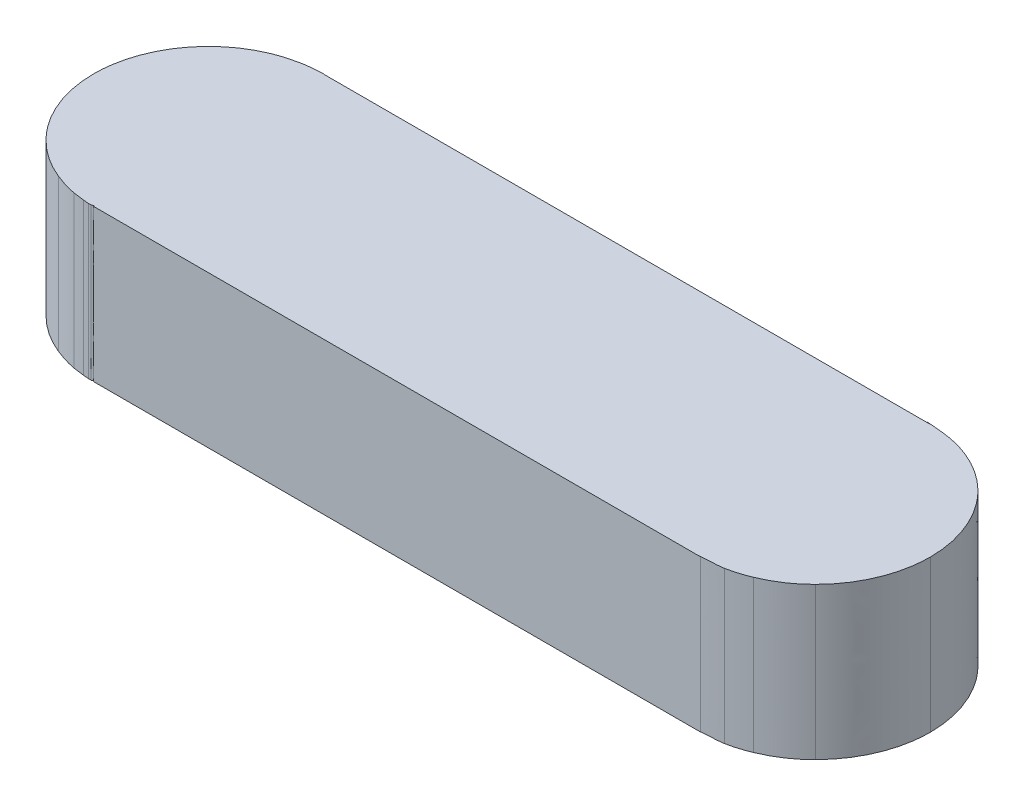
ISO-10303-21;
HEADER;
FILE_DESCRIPTION(('STEP AP214'),'2;1');
FILE_NAME('part.step','',(''),(''),'','','');
FILE_SCHEMA(('AUTOMOTIVE_DESIGN { 1 0 10303 214 1 1 1 1 }'));
ENDSEC;
DATA;
#1=APPLICATION_CONTEXT('core data for automotive mechanical design processes');
#2=APPLICATION_PROTOCOL_DEFINITION('international standard','automotive_design',2000,#1);
#3=PRODUCT_CONTEXT('',#1,'mechanical');
#4=PRODUCT('Part','Part','',(#3));
#5=PRODUCT_RELATED_PRODUCT_CATEGORY('part','',(#4));
#6=PRODUCT_DEFINITION_FORMATION('','',#4);
#7=PRODUCT_DEFINITION_CONTEXT('part definition',#1,'design');
#8=PRODUCT_DEFINITION('design','',#6,#7);
#9=PRODUCT_DEFINITION_SHAPE('','',#8);
#10=(LENGTH_UNIT() NAMED_UNIT(*) SI_UNIT(.MILLI.,.METRE.));
#11=(NAMED_UNIT(*) PLANE_ANGLE_UNIT() SI_UNIT($,.RADIAN.));
#12=(NAMED_UNIT(*) SI_UNIT($,.STERADIAN.) SOLID_ANGLE_UNIT());
#13=UNCERTAINTY_MEASURE_WITH_UNIT(LENGTH_MEASURE(1.E-05),#10,'distance_accuracy_value','');
#14=(GEOMETRIC_REPRESENTATION_CONTEXT(3) GLOBAL_UNCERTAINTY_ASSIGNED_CONTEXT((#13)) GLOBAL_UNIT_ASSIGNED_CONTEXT((#10,
#11,#12)) REPRESENTATION_CONTEXT('',''));
#15=CARTESIAN_POINT('',(0.,0.,0.));
#16=DIRECTION('',(0.,0.,1.));
#17=DIRECTION('',(1.,0.,0.));
#18=AXIS2_PLACEMENT_3D('',#15,#16,#17);
#19=CARTESIAN_POINT('',(5.0230024,6.35,-9.8240342));
#20=CARTESIAN_POINT('',(5.091938,6.35,-9.8440494));
#21=CARTESIAN_POINT('',(4.9471326,6.35,-9.8240342));
#22=CARTESIAN_POINT('',(4.912741,6.35,-9.8240342));
#23=B_SPLINE_CURVE_WITH_KNOTS('',3,(#19,#20,#21,#22),.UNSPECIFIED.,.F.,.F.,(4,4),(0.,1.),.UNSPECIFIED.);
#24=DIRECTION('',(0.,-1.,0.));
#25=VECTOR('',#24,1.);
#26=SURFACE_OF_LINEAR_EXTRUSION('',#23,#25);
#27=CARTESIAN_POINT('',(5.0230024,0.,-9.8240342));
#28=CARTESIAN_POINT('',(5.091938,0.,-9.8440494));
#29=CARTESIAN_POINT('',(4.9471326,0.,-9.8240342));
#30=CARTESIAN_POINT('',(4.912741,0.,-9.8240342));
#31=B_SPLINE_CURVE_WITH_KNOTS('',3,(#27,#28,#29,#30),.UNSPECIFIED.,.F.,.F.,(4,4),(0.,1.),.UNSPECIFIED.);
#32=CARTESIAN_POINT('',(5.0230024,0.,-9.8240342));
#33=VERTEX_POINT('',#32);
#34=CARTESIAN_POINT('',(4.912741,0.,-9.8240342));
#35=VERTEX_POINT('',#34);
#36=EDGE_CURVE('E466',#33,#35,#31,.T.);
#37=ORIENTED_EDGE('',*,*,#36,.T.);
#38=DIRECTION('',(0.,-1.,0.));
#39=VECTOR('',#38,1.);
#40=CARTESIAN_POINT('',(4.912741,6.35,-9.8240342));
#41=LINE('',#40,#39);
#42=CARTESIAN_POINT('',(4.912741,6.35,-9.8240342));
#43=VERTEX_POINT('',#42);
#44=EDGE_CURVE('E11',#43,#35,#41,.T.);
#45=ORIENTED_EDGE('',*,*,#44,.F.);
#46=CARTESIAN_POINT('',(5.0230024,6.35,-9.8240342));
#47=VERTEX_POINT('',#46);
#48=EDGE_CURVE('E442',#47,#43,#23,.T.);
#49=ORIENTED_EDGE('',*,*,#48,.F.);
#50=DIRECTION('',(0.,-1.,0.));
#51=VECTOR('',#50,1.);
#52=CARTESIAN_POINT('',(5.0230024,6.35,-9.8240342));
#53=LINE('',#52,#51);
#54=EDGE_CURVE('E223',#47,#33,#53,.T.);
#55=ORIENTED_EDGE('',*,*,#54,.T.);
#56=EDGE_LOOP('',(#37,#45,#49,#55));
#57=FACE_BOUND('',#56,.T.);
#58=ADVANCED_FACE('F34',(#57),#26,.F.);
#59=CARTESIAN_POINT('',(4.912741,6.35,-9.8240342));
#60=CARTESIAN_POINT('',(4.8782478,6.35,-9.8240342));
#61=CARTESIAN_POINT('',(4.8368966,6.35,-9.8190304));
#62=CARTESIAN_POINT('',(4.802505,6.35,-9.8190304));
#63=B_SPLINE_CURVE_WITH_KNOTS('',3,(#59,#60,#61,#62),.UNSPECIFIED.,.F.,.F.,(4,4),(0.,1.),.UNSPECIFIED.);
#64=DIRECTION('',(0.,-1.,0.));
#65=VECTOR('',#64,1.);
#66=SURFACE_OF_LINEAR_EXTRUSION('',#63,#65);
#67=CARTESIAN_POINT('',(4.912741,0.,-9.8240342));
#68=CARTESIAN_POINT('',(4.8782478,0.,-9.8240342));
#69=CARTESIAN_POINT('',(4.8368966,0.,-9.8190304));
#70=CARTESIAN_POINT('',(4.802505,0.,-9.8190304));
#71=B_SPLINE_CURVE_WITH_KNOTS('',3,(#67,#68,#69,#70),.UNSPECIFIED.,.F.,.F.,(4,4),(0.,1.),.UNSPECIFIED.);
#72=CARTESIAN_POINT('',(4.802505,0.,-9.8190304));
#73=VERTEX_POINT('',#72);
#74=EDGE_CURVE('E457',#35,#73,#71,.T.);
#75=ORIENTED_EDGE('',*,*,#74,.T.);
#76=DIRECTION('',(0.,-1.,0.));
#77=VECTOR('',#76,1.);
#78=CARTESIAN_POINT('',(4.802505,6.35,-9.8190304));
#79=LINE('',#78,#77);
#80=CARTESIAN_POINT('',(4.802505,6.35,-9.8190304));
#81=VERTEX_POINT('',#80);
#82=EDGE_CURVE('E43',#81,#73,#79,.T.);
#83=ORIENTED_EDGE('',*,*,#82,.F.);
#84=EDGE_CURVE('E142',#43,#81,#63,.T.);
#85=ORIENTED_EDGE('',*,*,#84,.F.);
#86=ORIENTED_EDGE('',*,*,#44,.T.);
#87=EDGE_LOOP('',(#75,#83,#85,#86));
#88=FACE_BOUND('',#87,.T.);
#89=ADVANCED_FACE('F449',(#88),#66,.F.);
#90=CARTESIAN_POINT('',(4.802505,6.35,-9.8190304));
#91=CARTESIAN_POINT('',(4.7266352,6.35,-9.8190304));
#92=CARTESIAN_POINT('',(4.650994,6.35,-9.814052));
#93=CARTESIAN_POINT('',(4.5750988,6.35,-9.8040444));
#94=B_SPLINE_CURVE_WITH_KNOTS('',3,(#90,#91,#92,#93),.UNSPECIFIED.,.F.,.F.,(4,4),(0.,1.),.UNSPECIFIED.);
#95=DIRECTION('',(0.,-1.,0.));
#96=VECTOR('',#95,1.);
#97=SURFACE_OF_LINEAR_EXTRUSION('',#94,#96);
#98=CARTESIAN_POINT('',(4.802505,0.,-9.8190304));
#99=CARTESIAN_POINT('',(4.7266352,0.,-9.8190304));
#100=CARTESIAN_POINT('',(4.650994,0.,-9.814052));
#101=CARTESIAN_POINT('',(4.5750988,0.,-9.8040444));
#102=B_SPLINE_CURVE_WITH_KNOTS('',3,(#98,#99,#100,#101),.UNSPECIFIED.,.F.,.F.,(4,4),(0.,1.),.UNSPECIFIED.);
#103=CARTESIAN_POINT('',(4.5750988,0.,-9.8040444));
#104=VERTEX_POINT('',#103);
#105=EDGE_CURVE('E465',#73,#104,#102,.T.);
#106=ORIENTED_EDGE('',*,*,#105,.T.);
#107=DIRECTION('',(0.,-1.,0.));
#108=VECTOR('',#107,1.);
#109=CARTESIAN_POINT('',(4.5750988,6.35,-9.8040444));
#110=LINE('',#109,#108);
#111=CARTESIAN_POINT('',(4.5750988,6.35,-9.8040444));
#112=VERTEX_POINT('',#111);
#113=EDGE_CURVE('E470',#112,#104,#110,.T.);
#114=ORIENTED_EDGE('',*,*,#113,.F.);
#115=EDGE_CURVE('E428',#81,#112,#94,.T.);
#116=ORIENTED_EDGE('',*,*,#115,.F.);
#117=ORIENTED_EDGE('',*,*,#82,.T.);
#118=EDGE_LOOP('',(#106,#114,#116,#117));
#119=FACE_BOUND('',#118,.T.);
#120=ADVANCED_FACE('F421',(#119),#97,.F.);
#121=CARTESIAN_POINT('',(4.5750988,6.35,-9.8040444));
#122=CARTESIAN_POINT('',(4.4167044,6.35,-9.789033));
#123=CARTESIAN_POINT('',(4.265041,6.35,-9.7690432));
#124=CARTESIAN_POINT('',(4.1134538,6.35,-9.7350326));
#125=B_SPLINE_CURVE_WITH_KNOTS('',3,(#121,#122,#123,#124),.UNSPECIFIED.,.F.,.F.,(4,4),(0.,1.),.UNSPECIFIED.);
#126=DIRECTION('',(0.,-1.,0.));
#127=VECTOR('',#126,1.);
#128=SURFACE_OF_LINEAR_EXTRUSION('',#125,#127);
#129=CARTESIAN_POINT('',(4.5750988,0.,-9.8040444));
#130=CARTESIAN_POINT('',(4.4167044,0.,-9.789033));
#131=CARTESIAN_POINT('',(4.265041,0.,-9.7690432));
#132=CARTESIAN_POINT('',(4.1134538,0.,-9.7350326));
#133=B_SPLINE_CURVE_WITH_KNOTS('',3,(#129,#130,#131,#132),.UNSPECIFIED.,.F.,.F.,(4,4),(0.,1.),.UNSPECIFIED.);
#134=CARTESIAN_POINT('',(4.1134538,0.,-9.7350326));
#135=VERTEX_POINT('',#134);
#136=EDGE_CURVE('E474',#104,#135,#133,.T.);
#137=ORIENTED_EDGE('',*,*,#136,.T.);
#138=DIRECTION('',(0.,-1.,0.));
#139=VECTOR('',#138,1.);
#140=CARTESIAN_POINT('',(4.1134538,6.35,-9.7350326));
#141=LINE('',#140,#139);
#142=CARTESIAN_POINT('',(4.1134538,6.35,-9.7350326));
#143=VERTEX_POINT('',#142);
#144=EDGE_CURVE('E668',#143,#135,#141,.T.);
#145=ORIENTED_EDGE('',*,*,#144,.F.);
#146=EDGE_CURVE('E424',#112,#143,#125,.T.);
#147=ORIENTED_EDGE('',*,*,#146,.F.);
#148=ORIENTED_EDGE('',*,*,#113,.T.);
#149=EDGE_LOOP('',(#137,#145,#147,#148));
#150=FACE_BOUND('',#149,.T.);
#151=ADVANCED_FACE('F417',(#150),#128,.F.);
#152=CARTESIAN_POINT('',(4.1134538,6.35,-9.7350326));
#153=CARTESIAN_POINT('',(3.7964872,6.35,-9.6730312));
#154=CARTESIAN_POINT('',(3.4864548,6.35,-9.583547));
#155=CARTESIAN_POINT('',(3.1832804,6.35,-9.4595442));
#156=B_SPLINE_CURVE_WITH_KNOTS('',3,(#152,#153,#154,#155),.UNSPECIFIED.,.F.,.F.,(4,4),(0.,1.),.UNSPECIFIED.);
#157=DIRECTION('',(0.,-1.,0.));
#158=VECTOR('',#157,1.);
#159=SURFACE_OF_LINEAR_EXTRUSION('',#156,#158);
#160=CARTESIAN_POINT('',(4.1134538,0.,-9.7350326));
#161=CARTESIAN_POINT('',(3.7964872,0.,-9.6730312));
#162=CARTESIAN_POINT('',(3.4864548,0.,-9.583547));
#163=CARTESIAN_POINT('',(3.1832804,0.,-9.4595442));
#164=B_SPLINE_CURVE_WITH_KNOTS('',3,(#160,#161,#162,#163),.UNSPECIFIED.,.F.,.F.,(4,4),(0.,1.),.UNSPECIFIED.);
#165=CARTESIAN_POINT('',(3.1832804,0.,-9.4595442));
#166=VERTEX_POINT('',#165);
#167=EDGE_CURVE('E476',#135,#166,#164,.T.);
#168=ORIENTED_EDGE('',*,*,#167,.T.);
#169=DIRECTION('',(0.,-1.,0.));
#170=VECTOR('',#169,1.);
#171=CARTESIAN_POINT('',(3.1832804,6.35,-9.4595442));
#172=LINE('',#171,#170);
#173=CARTESIAN_POINT('',(3.1832804,6.35,-9.4595442));
#174=VERTEX_POINT('',#173);
#175=EDGE_CURVE('E665',#174,#166,#172,.T.);
#176=ORIENTED_EDGE('',*,*,#175,.F.);
#177=EDGE_CURVE('E402',#143,#174,#156,.T.);
#178=ORIENTED_EDGE('',*,*,#177,.F.);
#179=ORIENTED_EDGE('',*,*,#144,.T.);
#180=EDGE_LOOP('',(#168,#176,#178,#179));
#181=FACE_BOUND('',#180,.T.);
#182=ADVANCED_FACE('F413',(#181),#159,.F.);
#183=CARTESIAN_POINT('',(3.1832804,6.35,-9.4595442));
#184=CARTESIAN_POINT('',(2.5838404,6.35,-9.2115386));
#185=CARTESIAN_POINT('',(2.0877276,6.35,-8.8738964));
#186=CARTESIAN_POINT('',(1.6260826,6.35,-8.4191348));
#187=B_SPLINE_CURVE_WITH_KNOTS('',3,(#183,#184,#185,#186),.UNSPECIFIED.,.F.,.F.,(4,4),(0.,1.),.UNSPECIFIED.);
#188=DIRECTION('',(0.,-1.,0.));
#189=VECTOR('',#188,1.);
#190=SURFACE_OF_LINEAR_EXTRUSION('',#187,#189);
#191=CARTESIAN_POINT('',(3.1832804,0.,-9.4595442));
#192=CARTESIAN_POINT('',(2.5838404,0.,-9.2115386));
#193=CARTESIAN_POINT('',(2.0877276,0.,-8.8738964));
#194=CARTESIAN_POINT('',(1.6260826,0.,-8.4191348));
#195=B_SPLINE_CURVE_WITH_KNOTS('',3,(#191,#192,#193,#194),.UNSPECIFIED.,.F.,.F.,(4,4),(0.,1.),.UNSPECIFIED.);
#196=CARTESIAN_POINT('',(1.6260826,0.,-8.4191348));
#197=VERTEX_POINT('',#196);
#198=EDGE_CURVE('E494',#166,#197,#195,.T.);
#199=ORIENTED_EDGE('',*,*,#198,.T.);
#200=DIRECTION('',(0.,-1.,0.));
#201=VECTOR('',#200,1.);
#202=CARTESIAN_POINT('',(1.6260826,6.35,-8.4191348));
#203=LINE('',#202,#201);
#204=CARTESIAN_POINT('',(1.6260826,6.35,-8.4191348));
#205=VERTEX_POINT('',#204);
#206=EDGE_CURVE('E662',#205,#197,#203,.T.);
#207=ORIENTED_EDGE('',*,*,#206,.F.);
#208=EDGE_CURVE('E394',#174,#205,#187,.T.);
#209=ORIENTED_EDGE('',*,*,#208,.F.);
#210=ORIENTED_EDGE('',*,*,#175,.T.);
#211=EDGE_LOOP('',(#199,#207,#209,#210));
#212=FACE_BOUND('',#211,.T.);
#213=ADVANCED_FACE('F410',(#212),#190,.F.);
#214=CARTESIAN_POINT('',(1.6260826,6.35,-8.4191348));
#215=CARTESIAN_POINT('',(0.7234682,6.35,-7.5165458));
#216=CARTESIAN_POINT('',(0.2204974,6.35,-6.2969394));
#217=CARTESIAN_POINT('',(0.2204974,6.35,-5.0222404));
#218=B_SPLINE_CURVE_WITH_KNOTS('',3,(#214,#215,#216,#217),.UNSPECIFIED.,.F.,.F.,(4,4),(0.,1.),.UNSPECIFIED.);
#219=DIRECTION('',(0.,-1.,0.));
#220=VECTOR('',#219,1.);
#221=SURFACE_OF_LINEAR_EXTRUSION('',#218,#220);
#222=CARTESIAN_POINT('',(1.6260826,0.,-8.4191348));
#223=CARTESIAN_POINT('',(0.7234682,0.,-7.5165458));
#224=CARTESIAN_POINT('',(0.2204974,0.,-6.2969394));
#225=CARTESIAN_POINT('',(0.2204974,0.,-5.0222404));
#226=B_SPLINE_CURVE_WITH_KNOTS('',3,(#222,#223,#224,#225),.UNSPECIFIED.,.F.,.F.,(4,4),(0.,1.),.UNSPECIFIED.);
#227=CARTESIAN_POINT('',(0.2204974,0.,-5.0222404));
#228=VERTEX_POINT('',#227);
#229=EDGE_CURVE('E501',#197,#228,#226,.T.);
#230=ORIENTED_EDGE('',*,*,#229,.T.);
#231=DIRECTION('',(0.,-1.,0.));
#232=VECTOR('',#231,1.);
#233=CARTESIAN_POINT('',(0.2204974,6.35,-5.0222404));
#234=LINE('',#233,#232);
#235=CARTESIAN_POINT('',(0.2204974,6.35,-5.0222404));
#236=VERTEX_POINT('',#235);
#237=EDGE_CURVE('E659',#236,#228,#234,.T.);
#238=ORIENTED_EDGE('',*,*,#237,.F.);
#239=EDGE_CURVE('E386',#205,#236,#218,.T.);
#240=ORIENTED_EDGE('',*,*,#239,.F.);
#241=ORIENTED_EDGE('',*,*,#206,.T.);
#242=EDGE_LOOP('',(#230,#238,#240,#241));
#243=FACE_BOUND('',#242,.T.);
#244=ADVANCED_FACE('F378',(#243),#221,.F.);
#245=CARTESIAN_POINT('',(0.2204974,6.35,-5.0222404));
#246=CARTESIAN_POINT('',(0.2204974,6.35,-3.7475922));
#247=CARTESIAN_POINT('',(0.7234682,6.35,-2.5280366));
#248=CARTESIAN_POINT('',(1.6260826,6.35,-1.6253968));
#249=B_SPLINE_CURVE_WITH_KNOTS('',3,(#245,#246,#247,#248),.UNSPECIFIED.,.F.,.F.,(4,4),(0.,1.),.UNSPECIFIED.);
#250=DIRECTION('',(0.,-1.,0.));
#251=VECTOR('',#250,1.);
#252=SURFACE_OF_LINEAR_EXTRUSION('',#249,#251);
#253=CARTESIAN_POINT('',(0.2204974,0.,-5.0222404));
#254=CARTESIAN_POINT('',(0.2204974,0.,-3.7475922));
#255=CARTESIAN_POINT('',(0.7234682,0.,-2.5280366));
#256=CARTESIAN_POINT('',(1.6260826,0.,-1.6253968));
#257=B_SPLINE_CURVE_WITH_KNOTS('',3,(#253,#254,#255,#256),.UNSPECIFIED.,.F.,.F.,(4,4),(0.,1.),.UNSPECIFIED.);
#258=CARTESIAN_POINT('',(1.6260826,0.,-1.6253968));
#259=VERTEX_POINT('',#258);
#260=EDGE_CURVE('E508',#228,#259,#257,.T.);
#261=ORIENTED_EDGE('',*,*,#260,.T.);
#262=DIRECTION('',(0.,-1.,0.));
#263=VECTOR('',#262,1.);
#264=CARTESIAN_POINT('',(1.6260826,6.35,-1.6253968));
#265=LINE('',#264,#263);
#266=CARTESIAN_POINT('',(1.6260826,6.35,-1.6253968));
#267=VERTEX_POINT('',#266);
#268=EDGE_CURVE('E656',#267,#259,#265,.T.);
#269=ORIENTED_EDGE('',*,*,#268,.F.);
#270=EDGE_CURVE('E382',#236,#267,#249,.T.);
#271=ORIENTED_EDGE('',*,*,#270,.F.);
#272=ORIENTED_EDGE('',*,*,#237,.T.);
#273=EDGE_LOOP('',(#261,#269,#271,#272));
#274=FACE_BOUND('',#273,.T.);
#275=ADVANCED_FACE('F374',(#274),#252,.F.);
#276=CARTESIAN_POINT('',(1.6260826,6.35,-1.6253968));
#277=CARTESIAN_POINT('',(2.087753,6.35,-1.1638788));
#278=CARTESIAN_POINT('',(2.5838404,6.35,-0.8330438));
#279=CARTESIAN_POINT('',(3.1832804,6.35,-0.5849874));
#280=B_SPLINE_CURVE_WITH_KNOTS('',3,(#276,#277,#278,#279),.UNSPECIFIED.,.F.,.F.,(4,4),(0.,1.),.UNSPECIFIED.);
#281=DIRECTION('',(0.,-1.,0.));
#282=VECTOR('',#281,1.);
#283=SURFACE_OF_LINEAR_EXTRUSION('',#280,#282);
#284=CARTESIAN_POINT('',(1.6260826,0.,-1.6253968));
#285=CARTESIAN_POINT('',(2.087753,0.,-1.1638788));
#286=CARTESIAN_POINT('',(2.5838404,0.,-0.8330438));
#287=CARTESIAN_POINT('',(3.1832804,0.,-0.5849874));
#288=B_SPLINE_CURVE_WITH_KNOTS('',3,(#284,#285,#286,#287),.UNSPECIFIED.,.F.,.F.,(4,4),(0.,1.),.UNSPECIFIED.);
#289=CARTESIAN_POINT('',(3.1832804,0.,-0.5849874));
#290=VERTEX_POINT('',#289);
#291=EDGE_CURVE('E515',#259,#290,#288,.T.);
#292=ORIENTED_EDGE('',*,*,#291,.T.);
#293=DIRECTION('',(0.,-1.,0.));
#294=VECTOR('',#293,1.);
#295=CARTESIAN_POINT('',(3.1832804,6.35,-0.5849874));
#296=LINE('',#295,#294);
#297=CARTESIAN_POINT('',(3.1832804,6.35,-0.5849874));
#298=VERTEX_POINT('',#297);
#299=EDGE_CURVE('E653',#298,#290,#296,.T.);
#300=ORIENTED_EDGE('',*,*,#299,.F.);
#301=EDGE_CURVE('E359',#267,#298,#280,.T.);
#302=ORIENTED_EDGE('',*,*,#301,.F.);
#303=ORIENTED_EDGE('',*,*,#268,.T.);
#304=EDGE_LOOP('',(#292,#300,#302,#303));
#305=FACE_BOUND('',#304,.T.);
#306=ADVANCED_FACE('F370',(#305),#283,.F.);
#307=CARTESIAN_POINT('',(3.1832804,6.35,-0.5849874));
#308=CARTESIAN_POINT('',(3.4864802,6.35,-0.4609846));
#309=CARTESIAN_POINT('',(3.7965126,6.35,-0.36449));
#310=CARTESIAN_POINT('',(4.1134538,6.35,-0.3024886));
#311=B_SPLINE_CURVE_WITH_KNOTS('',3,(#307,#308,#309,#310),.UNSPECIFIED.,.F.,.F.,(4,4),(0.,1.),.UNSPECIFIED.);
#312=DIRECTION('',(0.,-1.,0.));
#313=VECTOR('',#312,1.);
#314=SURFACE_OF_LINEAR_EXTRUSION('',#311,#313);
#315=CARTESIAN_POINT('',(3.1832804,0.,-0.5849874));
#316=CARTESIAN_POINT('',(3.4864802,0.,-0.4609846));
#317=CARTESIAN_POINT('',(3.7965126,0.,-0.36449));
#318=CARTESIAN_POINT('',(4.1134538,0.,-0.3024886));
#319=B_SPLINE_CURVE_WITH_KNOTS('',3,(#315,#316,#317,#318),.UNSPECIFIED.,.F.,.F.,(4,4),(0.,1.),.UNSPECIFIED.);
#320=CARTESIAN_POINT('',(4.1134538,0.,-0.3024886));
#321=VERTEX_POINT('',#320);
#322=EDGE_CURVE('E522',#290,#321,#319,.T.);
#323=ORIENTED_EDGE('',*,*,#322,.T.);
#324=DIRECTION('',(0.,-1.,0.));
#325=VECTOR('',#324,1.);
#326=CARTESIAN_POINT('',(4.1134538,6.35,-0.3024886));
#327=LINE('',#326,#325);
#328=CARTESIAN_POINT('',(4.1134538,6.35,-0.3024886));
#329=VERTEX_POINT('',#328);
#330=EDGE_CURVE('E650',#329,#321,#327,.T.);
#331=ORIENTED_EDGE('',*,*,#330,.F.);
#332=EDGE_CURVE('E351',#298,#329,#311,.T.);
#333=ORIENTED_EDGE('',*,*,#332,.F.);
#334=ORIENTED_EDGE('',*,*,#299,.T.);
#335=EDGE_LOOP('',(#323,#331,#333,#334));
#336=FACE_BOUND('',#335,.T.);
#337=ADVANCED_FACE('F367',(#336),#314,.F.);
#338=CARTESIAN_POINT('',(4.1134538,6.35,-0.3024886));
#339=CARTESIAN_POINT('',(4.2649394,6.35,-0.277495));
#340=CARTESIAN_POINT('',(4.4166028,6.35,-0.2525014));
#341=CARTESIAN_POINT('',(4.5750988,6.35,-0.2404872));
#342=B_SPLINE_CURVE_WITH_KNOTS('',3,(#338,#339,#340,#341),.UNSPECIFIED.,.F.,.F.,(4,4),(0.,1.),.UNSPECIFIED.);
#343=DIRECTION('',(0.,-1.,0.));
#344=VECTOR('',#343,1.);
#345=SURFACE_OF_LINEAR_EXTRUSION('',#342,#344);
#346=CARTESIAN_POINT('',(4.1134538,0.,-0.3024886));
#347=CARTESIAN_POINT('',(4.2649394,0.,-0.277495));
#348=CARTESIAN_POINT('',(4.4166028,0.,-0.2525014));
#349=CARTESIAN_POINT('',(4.5750988,0.,-0.2404872));
#350=B_SPLINE_CURVE_WITH_KNOTS('',3,(#346,#347,#348,#349),.UNSPECIFIED.,.F.,.F.,(4,4),(0.,1.),.UNSPECIFIED.);
#351=CARTESIAN_POINT('',(4.5750988,0.,-0.2404872));
#352=VERTEX_POINT('',#351);
#353=EDGE_CURVE('E529',#321,#352,#350,.T.);
#354=ORIENTED_EDGE('',*,*,#353,.T.);
#355=DIRECTION('',(0.,-1.,0.));
#356=VECTOR('',#355,1.);
#357=CARTESIAN_POINT('',(4.5750988,6.35,-0.2404872));
#358=LINE('',#357,#356);
#359=CARTESIAN_POINT('',(4.5750988,6.35,-0.2404872));
#360=VERTEX_POINT('',#359);
#361=EDGE_CURVE('E647',#360,#352,#358,.T.);
#362=ORIENTED_EDGE('',*,*,#361,.F.);
#363=EDGE_CURVE('E343',#329,#360,#342,.T.);
#364=ORIENTED_EDGE('',*,*,#363,.F.);
#365=ORIENTED_EDGE('',*,*,#330,.T.);
#366=EDGE_LOOP('',(#354,#362,#364,#365));
#367=FACE_BOUND('',#366,.T.);
#368=ADVANCED_FACE('F335',(#367),#345,.F.);
#369=CARTESIAN_POINT('',(4.5750988,6.35,-0.2404872));
#370=CARTESIAN_POINT('',(4.6509432,6.35,-0.2354834));
#371=CARTESIAN_POINT('',(4.7265844,6.35,-0.2255012));
#372=CARTESIAN_POINT('',(4.802505,6.35,-0.2204974));
#373=B_SPLINE_CURVE_WITH_KNOTS('',3,(#369,#370,#371,#372),.UNSPECIFIED.,.F.,.F.,(4,4),(0.,1.),.UNSPECIFIED.);
#374=DIRECTION('',(0.,-1.,0.));
#375=VECTOR('',#374,1.);
#376=SURFACE_OF_LINEAR_EXTRUSION('',#373,#375);
#377=CARTESIAN_POINT('',(4.5750988,0.,-0.2404872));
#378=CARTESIAN_POINT('',(4.6509432,0.,-0.2354834));
#379=CARTESIAN_POINT('',(4.7265844,0.,-0.2255012));
#380=CARTESIAN_POINT('',(4.802505,0.,-0.2204974));
#381=B_SPLINE_CURVE_WITH_KNOTS('',3,(#377,#378,#379,#380),.UNSPECIFIED.,.F.,.F.,(4,4),(0.,1.),.UNSPECIFIED.);
#382=CARTESIAN_POINT('',(4.802505,0.,-0.2204974));
#383=VERTEX_POINT('',#382);
#384=EDGE_CURVE('E536',#352,#383,#381,.T.);
#385=ORIENTED_EDGE('',*,*,#384,.T.);
#386=DIRECTION('',(0.,-1.,0.));
#387=VECTOR('',#386,1.);
#388=CARTESIAN_POINT('',(4.802505,6.35,-0.2204974));
#389=LINE('',#388,#387);
#390=CARTESIAN_POINT('',(4.802505,6.35,-0.2204974));
#391=VERTEX_POINT('',#390);
#392=EDGE_CURVE('E644',#391,#383,#389,.T.);
#393=ORIENTED_EDGE('',*,*,#392,.F.);
#394=EDGE_CURVE('E339',#360,#391,#373,.T.);
#395=ORIENTED_EDGE('',*,*,#394,.F.);
#396=ORIENTED_EDGE('',*,*,#361,.T.);
#397=EDGE_LOOP('',(#385,#393,#395,#396));
#398=FACE_BOUND('',#397,.T.);
#399=ADVANCED_FACE('F331',(#398),#376,.F.);
#400=CARTESIAN_POINT('',(4.802505,6.35,-0.2204974));
#401=DIRECTION('',(0.,0.,-1.));
#402=DIRECTION('',(-1.,0.,0.));
#403=AXIS2_PLACEMENT_3D('',#400,#401,#402);
#404=PLANE('',#403);
#405=CARTESIAN_POINT('',(4.802505,0.,-0.2204974));
#406=CARTESIAN_POINT('',(4.8369982,0.,-0.2204974));
#407=CARTESIAN_POINT('',(4.8783494,0.,-0.2204974));
#408=CARTESIAN_POINT('',(4.912741,0.,-0.2204974));
#409=B_SPLINE_CURVE_WITH_KNOTS('',3,(#405,#406,#407,#408),.UNSPECIFIED.,.F.,.F.,(4,4),(0.,1.),.UNSPECIFIED.);
#410=CARTESIAN_POINT('',(4.912741,0.,-0.2204974));
#411=VERTEX_POINT('',#410);
#412=EDGE_CURVE('E543',#383,#411,#409,.T.);
#413=ORIENTED_EDGE('',*,*,#412,.T.);
#414=DIRECTION('',(0.,-1.,0.));
#415=VECTOR('',#414,1.);
#416=CARTESIAN_POINT('',(4.912741,6.35,-0.2204974));
#417=LINE('',#416,#415);
#418=CARTESIAN_POINT('',(4.912741,6.35,-0.2204974));
#419=VERTEX_POINT('',#418);
#420=EDGE_CURVE('E641',#419,#411,#417,.T.);
#421=ORIENTED_EDGE('',*,*,#420,.F.);
#422=CARTESIAN_POINT('',(4.802505,6.35,-0.2204974));
#423=CARTESIAN_POINT('',(4.8369982,6.35,-0.2204974));
#424=CARTESIAN_POINT('',(4.8783494,6.35,-0.2204974));
#425=CARTESIAN_POINT('',(4.912741,6.35,-0.2204974));
#426=B_SPLINE_CURVE_WITH_KNOTS('',3,(#422,#423,#424,#425),.UNSPECIFIED.,.F.,.F.,(4,4),(0.,1.),.UNSPECIFIED.);
#427=EDGE_CURVE('E315',#391,#419,#426,.T.);
#428=ORIENTED_EDGE('',*,*,#427,.F.);
#429=ORIENTED_EDGE('',*,*,#392,.T.);
#430=EDGE_LOOP('',(#413,#421,#428,#429));
#431=FACE_BOUND('',#430,.T.);
#432=ADVANCED_FACE('F327',(#431),#404,.F.);
#433=CARTESIAN_POINT('',(4.912741,6.35,-0.2204974));
#434=CARTESIAN_POINT('',(4.9472342,6.35,-0.2204974));
#435=CARTESIAN_POINT('',(5.0230024,6.35,-0.2894838));
#436=CARTESIAN_POINT('',(5.0230024,6.35,-0.2204974));
#437=B_SPLINE_CURVE_WITH_KNOTS('',3,(#433,#434,#435,#436),.UNSPECIFIED.,.F.,.F.,(4,4),(0.,1.),.UNSPECIFIED.);
#438=DIRECTION('',(0.,-1.,0.));
#439=VECTOR('',#438,1.);
#440=SURFACE_OF_LINEAR_EXTRUSION('',#437,#439);
#441=CARTESIAN_POINT('',(4.912741,0.,-0.2204974));
#442=CARTESIAN_POINT('',(4.9472342,0.,-0.2204974));
#443=CARTESIAN_POINT('',(5.0230024,0.,-0.2894838));
#444=CARTESIAN_POINT('',(5.0230024,0.,-0.2204974));
#445=B_SPLINE_CURVE_WITH_KNOTS('',3,(#441,#442,#443,#444),.UNSPECIFIED.,.F.,.F.,(4,4),(0.,1.),.UNSPECIFIED.);
#446=CARTESIAN_POINT('',(5.0230024,0.,-0.2204974));
#447=VERTEX_POINT('',#446);
#448=EDGE_CURVE('E550',#411,#447,#445,.T.);
#449=ORIENTED_EDGE('',*,*,#448,.T.);
#450=DIRECTION('',(0.,-1.,0.));
#451=VECTOR('',#450,1.);
#452=CARTESIAN_POINT('',(5.0230024,6.35,-0.2204974));
#453=LINE('',#452,#451);
#454=CARTESIAN_POINT('',(5.0230024,6.35,-0.2204974));
#455=VERTEX_POINT('',#454);
#456=EDGE_CURVE('E638',#455,#447,#453,.T.);
#457=ORIENTED_EDGE('',*,*,#456,.F.);
#458=EDGE_CURVE('E310',#419,#455,#437,.T.);
#459=ORIENTED_EDGE('',*,*,#458,.F.);
#460=ORIENTED_EDGE('',*,*,#420,.T.);
#461=EDGE_LOOP('',(#449,#457,#459,#460));
#462=FACE_BOUND('',#461,.T.);
#463=ADVANCED_FACE('F323',(#462),#440,.F.);
#464=CARTESIAN_POINT('',(5.0230024,6.35,-0.2204974));
#465=DIRECTION('',(0.,0.,-1.));
#466=DIRECTION('',(-1.,0.,0.));
#467=AXIS2_PLACEMENT_3D('',#464,#465,#466);
#468=PLANE('',#467);
#469=DIRECTION('',(1.,0.,0.));
#470=VECTOR('',#469,1.);
#471=CARTESIAN_POINT('',(5.0230024,0.,-0.2204974));
#472=LINE('',#471,#470);
#473=CARTESIAN_POINT('',(30.4202338,0.,-0.2204974));
#474=VERTEX_POINT('',#473);
#475=EDGE_CURVE('E557',#447,#474,#472,.T.);
#476=ORIENTED_EDGE('',*,*,#475,.T.);
#477=DIRECTION('',(0.,-1.,0.));
#478=VECTOR('',#477,1.);
#479=CARTESIAN_POINT('',(30.4202338,6.35,-0.2204974));
#480=LINE('',#479,#478);
#481=CARTESIAN_POINT('',(30.4202338,6.35,-0.2204974));
#482=VERTEX_POINT('',#481);
#483=EDGE_CURVE('E635',#482,#474,#480,.T.);
#484=ORIENTED_EDGE('',*,*,#483,.F.);
#485=DIRECTION('',(1.,0.,0.));
#486=VECTOR('',#485,1.);
#487=CARTESIAN_POINT('',(5.0230024,6.35,-0.2204974));
#488=LINE('',#487,#486);
#489=EDGE_CURVE('E305',#455,#482,#488,.T.);
#490=ORIENTED_EDGE('',*,*,#489,.F.);
#491=ORIENTED_EDGE('',*,*,#456,.T.);
#492=EDGE_LOOP('',(#476,#484,#490,#491));
#493=FACE_BOUND('',#492,.T.);
#494=ADVANCED_FACE('F326',(#493),#468,.F.);
#495=CARTESIAN_POINT('',(30.4202338,6.35,-0.2204974));
#496=CARTESIAN_POINT('',(29.8139104,6.35,-0.2204974));
#497=CARTESIAN_POINT('',(31.033466,6.35,-0.245491));
#498=CARTESIAN_POINT('',(31.3297316,6.35,-0.3029966));
#499=B_SPLINE_CURVE_WITH_KNOTS('',3,(#495,#496,#497,#498),.UNSPECIFIED.,.F.,.F.,(4,4),(0.,1.),.UNSPECIFIED.);
#500=DIRECTION('',(0.,-1.,0.));
#501=VECTOR('',#500,1.);
#502=SURFACE_OF_LINEAR_EXTRUSION('',#499,#501);
#503=CARTESIAN_POINT('',(30.4202338,0.,-0.2204974));
#504=CARTESIAN_POINT('',(29.8139104,0.,-0.2204974));
#505=CARTESIAN_POINT('',(31.033466,0.,-0.245491));
#506=CARTESIAN_POINT('',(31.3297316,0.,-0.3029966));
#507=B_SPLINE_CURVE_WITH_KNOTS('',3,(#503,#504,#505,#506),.UNSPECIFIED.,.F.,.F.,(4,4),(0.,1.),.UNSPECIFIED.);
#508=CARTESIAN_POINT('',(31.3297316,0.,-0.3029966));
#509=VERTEX_POINT('',#508);
#510=EDGE_CURVE('E562',#474,#509,#507,.T.);
#511=ORIENTED_EDGE('',*,*,#510,.T.);
#512=DIRECTION('',(0.,-1.,0.));
#513=VECTOR('',#512,1.);
#514=CARTESIAN_POINT('',(31.3297316,6.35,-0.3029966));
#515=LINE('',#514,#513);
#516=CARTESIAN_POINT('',(31.3297316,6.35,-0.3029966));
#517=VERTEX_POINT('',#516);
#518=EDGE_CURVE('E632',#517,#509,#515,.T.);
#519=ORIENTED_EDGE('',*,*,#518,.F.);
#520=EDGE_CURVE('E297',#482,#517,#499,.T.);
#521=ORIENTED_EDGE('',*,*,#520,.F.);
#522=ORIENTED_EDGE('',*,*,#483,.T.);
#523=EDGE_LOOP('',(#511,#519,#521,#522));
#524=FACE_BOUND('',#523,.T.);
#525=ADVANCED_FACE('F289',(#524),#502,.F.);
#526=CARTESIAN_POINT('',(31.3297316,6.35,-0.3029966));
#527=CARTESIAN_POINT('',(31.6535816,6.35,-0.364998));
#528=CARTESIAN_POINT('',(31.9636394,6.35,-0.4614926));
#529=CARTESIAN_POINT('',(32.259905,6.35,-0.5854954));
#530=B_SPLINE_CURVE_WITH_KNOTS('',3,(#526,#527,#528,#529),.UNSPECIFIED.,.F.,.F.,(4,4),(0.,1.),.UNSPECIFIED.);
#531=DIRECTION('',(0.,-1.,0.));
#532=VECTOR('',#531,1.);
#533=SURFACE_OF_LINEAR_EXTRUSION('',#530,#532);
#534=CARTESIAN_POINT('',(31.3297316,0.,-0.3029966));
#535=CARTESIAN_POINT('',(31.6535816,0.,-0.364998));
#536=CARTESIAN_POINT('',(31.9636394,0.,-0.4614926));
#537=CARTESIAN_POINT('',(32.259905,0.,-0.5854954));
#538=B_SPLINE_CURVE_WITH_KNOTS('',3,(#534,#535,#536,#537),.UNSPECIFIED.,.F.,.F.,(4,4),(0.,1.),.UNSPECIFIED.);
#539=CARTESIAN_POINT('',(32.259905,0.,-0.5854954));
#540=VERTEX_POINT('',#539);
#541=EDGE_CURVE('E566',#509,#540,#538,.T.);
#542=ORIENTED_EDGE('',*,*,#541,.T.);
#543=DIRECTION('',(0.,-1.,0.));
#544=VECTOR('',#543,1.);
#545=CARTESIAN_POINT('',(32.259905,6.35,-0.5854954));
#546=LINE('',#545,#544);
#547=CARTESIAN_POINT('',(32.259905,6.35,-0.5854954));
#548=VERTEX_POINT('',#547);
#549=EDGE_CURVE('E629',#548,#540,#546,.T.);
#550=ORIENTED_EDGE('',*,*,#549,.F.);
#551=EDGE_CURVE('E293',#517,#548,#530,.T.);
#552=ORIENTED_EDGE('',*,*,#551,.F.);
#553=ORIENTED_EDGE('',*,*,#518,.T.);
#554=EDGE_LOOP('',(#542,#550,#552,#553));
#555=FACE_BOUND('',#554,.T.);
#556=ADVANCED_FACE('F285',(#555),#533,.F.);
#557=CARTESIAN_POINT('',(32.259905,6.35,-0.5854954));
#558=CARTESIAN_POINT('',(32.8593704,6.35,-0.833501));
#559=CARTESIAN_POINT('',(33.3623412,6.35,-1.1642344));
#560=CARTESIAN_POINT('',(33.8171028,6.35,-1.6258794));
#561=B_SPLINE_CURVE_WITH_KNOTS('',3,(#557,#558,#559,#560),.UNSPECIFIED.,.F.,.F.,(4,4),(0.,1.),.UNSPECIFIED.);
#562=DIRECTION('',(0.,-1.,0.));
#563=VECTOR('',#562,1.);
#564=SURFACE_OF_LINEAR_EXTRUSION('',#561,#563);
#565=CARTESIAN_POINT('',(32.259905,0.,-0.5854954));
#566=CARTESIAN_POINT('',(32.8593704,0.,-0.833501));
#567=CARTESIAN_POINT('',(33.3623412,0.,-1.1642344));
#568=CARTESIAN_POINT('',(33.8171028,0.,-1.6258794));
#569=B_SPLINE_CURVE_WITH_KNOTS('',3,(#565,#566,#567,#568),.UNSPECIFIED.,.F.,.F.,(4,4),(0.,1.),.UNSPECIFIED.);
#570=CARTESIAN_POINT('',(33.8171028,0.,-1.6258794));
#571=VERTEX_POINT('',#570);
#572=EDGE_CURVE('E573',#540,#571,#569,.T.);
#573=ORIENTED_EDGE('',*,*,#572,.T.);
#574=DIRECTION('',(0.,-1.,0.));
#575=VECTOR('',#574,1.);
#576=CARTESIAN_POINT('',(33.8171028,6.35,-1.6258794));
#577=LINE('',#576,#575);
#578=CARTESIAN_POINT('',(33.8171028,6.35,-1.6258794));
#579=VERTEX_POINT('',#578);
#580=EDGE_CURVE('E626',#579,#571,#577,.T.);
#581=ORIENTED_EDGE('',*,*,#580,.F.);
#582=EDGE_CURVE('E270',#548,#579,#561,.T.);
#583=ORIENTED_EDGE('',*,*,#582,.F.);
#584=ORIENTED_EDGE('',*,*,#549,.T.);
#585=EDGE_LOOP('',(#573,#581,#583,#584));
#586=FACE_BOUND('',#585,.T.);
#587=ADVANCED_FACE('F281',(#586),#564,.F.);
#588=CARTESIAN_POINT('',(33.8171028,6.35,-1.6258794));
#589=CARTESIAN_POINT('',(34.7197172,6.35,-2.5216358));
#590=CARTESIAN_POINT('',(35.2295968,6.35,-3.7481002));
#591=CARTESIAN_POINT('',(35.2295968,6.35,-5.0227484));
#592=B_SPLINE_CURVE_WITH_KNOTS('',3,(#588,#589,#590,#591),.UNSPECIFIED.,.F.,.F.,(4,4),(0.,1.),.UNSPECIFIED.);
#593=DIRECTION('',(0.,-1.,0.));
#594=VECTOR('',#593,1.);
#595=SURFACE_OF_LINEAR_EXTRUSION('',#592,#594);
#596=CARTESIAN_POINT('',(33.8171028,0.,-1.6258794));
#597=CARTESIAN_POINT('',(34.7197172,0.,-2.5216358));
#598=CARTESIAN_POINT('',(35.2295968,0.,-3.7481002));
#599=CARTESIAN_POINT('',(35.2295968,0.,-5.0227484));
#600=B_SPLINE_CURVE_WITH_KNOTS('',3,(#596,#597,#598,#599),.UNSPECIFIED.,.F.,.F.,(4,4),(0.,1.),.UNSPECIFIED.);
#601=CARTESIAN_POINT('',(35.2295968,0.,-5.0227484));
#602=VERTEX_POINT('',#601);
#603=EDGE_CURVE('E580',#571,#602,#600,.T.);
#604=ORIENTED_EDGE('',*,*,#603,.T.);
#605=DIRECTION('',(0.,-1.,0.));
#606=VECTOR('',#605,1.);
#607=CARTESIAN_POINT('',(35.2295968,6.35,-5.0227484));
#608=LINE('',#607,#606);
#609=CARTESIAN_POINT('',(35.2295968,6.35,-5.0227484));
#610=VERTEX_POINT('',#609);
#611=EDGE_CURVE('E623',#610,#602,#608,.T.);
#612=ORIENTED_EDGE('',*,*,#611,.F.);
#613=EDGE_CURVE('E262',#579,#610,#592,.T.);
#614=ORIENTED_EDGE('',*,*,#613,.F.);
#615=ORIENTED_EDGE('',*,*,#580,.T.);
#616=EDGE_LOOP('',(#604,#612,#614,#615));
#617=FACE_BOUND('',#616,.T.);
#618=ADVANCED_FACE('F278',(#617),#595,.F.);
#619=CARTESIAN_POINT('',(35.2295968,6.35,-5.0227484));
#620=CARTESIAN_POINT('',(35.2295968,6.35,-6.2974474));
#621=CARTESIAN_POINT('',(34.7197172,6.35,-7.5169776));
#622=CARTESIAN_POINT('',(33.8239862,6.35,-8.4196428));
#623=B_SPLINE_CURVE_WITH_KNOTS('',3,(#619,#620,#621,#622),.UNSPECIFIED.,.F.,.F.,(4,4),(0.,1.),.UNSPECIFIED.);
#624=DIRECTION('',(0.,-1.,0.));
#625=VECTOR('',#624,1.);
#626=SURFACE_OF_LINEAR_EXTRUSION('',#623,#625);
#627=CARTESIAN_POINT('',(35.2295968,0.,-5.0227484));
#628=CARTESIAN_POINT('',(35.2295968,0.,-6.2974474));
#629=CARTESIAN_POINT('',(34.7197172,0.,-7.5169776));
#630=CARTESIAN_POINT('',(33.8239862,0.,-8.4196428));
#631=B_SPLINE_CURVE_WITH_KNOTS('',3,(#627,#628,#629,#630),.UNSPECIFIED.,.F.,.F.,(4,4),(0.,1.),.UNSPECIFIED.);
#632=CARTESIAN_POINT('',(33.8239862,0.,-8.4196428));
#633=VERTEX_POINT('',#632);
#634=EDGE_CURVE('E587',#602,#633,#631,.T.);
#635=ORIENTED_EDGE('',*,*,#634,.T.);
#636=DIRECTION('',(0.,-1.,0.));
#637=VECTOR('',#636,1.);
#638=CARTESIAN_POINT('',(33.8239862,6.35,-8.4196428));
#639=LINE('',#638,#637);
#640=CARTESIAN_POINT('',(33.8239862,6.35,-8.4196428));
#641=VERTEX_POINT('',#640);
#642=EDGE_CURVE('E620',#641,#633,#639,.T.);
#643=ORIENTED_EDGE('',*,*,#642,.F.);
#644=EDGE_CURVE('E254',#610,#641,#623,.T.);
#645=ORIENTED_EDGE('',*,*,#644,.F.);
#646=ORIENTED_EDGE('',*,*,#611,.T.);
#647=EDGE_LOOP('',(#635,#643,#645,#646));
#648=FACE_BOUND('',#647,.T.);
#649=ADVANCED_FACE('F247',(#648),#626,.F.);
#650=CARTESIAN_POINT('',(33.8239862,6.35,-8.4196428));
#651=CARTESIAN_POINT('',(33.3623412,6.35,-8.874633));
#652=CARTESIAN_POINT('',(32.8593704,6.35,-9.2119958));
#653=CARTESIAN_POINT('',(32.259905,6.35,-9.4600522));
#654=B_SPLINE_CURVE_WITH_KNOTS('',3,(#650,#651,#652,#653),.UNSPECIFIED.,.F.,.F.,(4,4),(0.,1.),.UNSPECIFIED.);
#655=DIRECTION('',(0.,-1.,0.));
#656=VECTOR('',#655,1.);
#657=SURFACE_OF_LINEAR_EXTRUSION('',#654,#656);
#658=CARTESIAN_POINT('',(33.8239862,0.,-8.4196428));
#659=CARTESIAN_POINT('',(33.3623412,0.,-8.874633));
#660=CARTESIAN_POINT('',(32.8593704,0.,-9.2119958));
#661=CARTESIAN_POINT('',(32.259905,0.,-9.4600522));
#662=B_SPLINE_CURVE_WITH_KNOTS('',3,(#658,#659,#660,#661),.UNSPECIFIED.,.F.,.F.,(4,4),(0.,1.),.UNSPECIFIED.);
#663=CARTESIAN_POINT('',(32.259905,0.,-9.4600522));
#664=VERTEX_POINT('',#663);
#665=EDGE_CURVE('E594',#633,#664,#662,.T.);
#666=ORIENTED_EDGE('',*,*,#665,.T.);
#667=DIRECTION('',(0.,-1.,0.));
#668=VECTOR('',#667,1.);
#669=CARTESIAN_POINT('',(32.259905,6.35,-9.4600522));
#670=LINE('',#669,#668);
#671=CARTESIAN_POINT('',(32.259905,6.35,-9.4600522));
#672=VERTEX_POINT('',#671);
#673=EDGE_CURVE('E218',#672,#664,#670,.T.);
#674=ORIENTED_EDGE('',*,*,#673,.F.);
#675=EDGE_CURVE('E209',#641,#672,#654,.T.);
#676=ORIENTED_EDGE('',*,*,#675,.F.);
#677=ORIENTED_EDGE('',*,*,#642,.T.);
#678=EDGE_LOOP('',(#666,#674,#676,#677));
#679=FACE_BOUND('',#678,.T.);
#680=ADVANCED_FACE('F244',(#679),#657,.F.);
#681=CARTESIAN_POINT('',(32.259905,6.35,-9.4600522));
#682=CARTESIAN_POINT('',(31.9636648,6.35,-9.5840296));
#683=CARTESIAN_POINT('',(31.6535816,6.35,-9.6735392));
#684=CARTESIAN_POINT('',(31.3297316,6.35,-9.7355406));
#685=B_SPLINE_CURVE_WITH_KNOTS('',3,(#681,#682,#683,#684),.UNSPECIFIED.,.F.,.F.,(4,4),(0.,1.),.UNSPECIFIED.);
#686=DIRECTION('',(0.,-1.,0.));
#687=VECTOR('',#686,1.);
#688=SURFACE_OF_LINEAR_EXTRUSION('',#685,#687);
#689=CARTESIAN_POINT('',(32.259905,0.,-9.4600522));
#690=CARTESIAN_POINT('',(31.9636648,0.,-9.5840296));
#691=CARTESIAN_POINT('',(31.6535816,0.,-9.6735392));
#692=CARTESIAN_POINT('',(31.3297316,0.,-9.7355406));
#693=B_SPLINE_CURVE_WITH_KNOTS('',3,(#689,#690,#691,#692),.UNSPECIFIED.,.F.,.F.,(4,4),(0.,1.),.UNSPECIFIED.);
#694=CARTESIAN_POINT('',(31.3297316,0.,-9.7355406));
#695=VERTEX_POINT('',#694);
#696=EDGE_CURVE('E217',#664,#695,#693,.T.);
#697=ORIENTED_EDGE('',*,*,#696,.T.);
#698=DIRECTION('',(0.,-1.,0.));
#699=VECTOR('',#698,1.);
#700=CARTESIAN_POINT('',(31.3297316,6.35,-9.7355406));
#701=LINE('',#700,#699);
#702=CARTESIAN_POINT('',(31.3297316,6.35,-9.7355406));
#703=VERTEX_POINT('',#702);
#704=EDGE_CURVE('E214',#703,#695,#701,.T.);
#705=ORIENTED_EDGE('',*,*,#704,.F.);
#706=EDGE_CURVE('E203',#672,#703,#685,.T.);
#707=ORIENTED_EDGE('',*,*,#706,.F.);
#708=ORIENTED_EDGE('',*,*,#673,.T.);
#709=EDGE_LOOP('',(#697,#705,#707,#708));
#710=FACE_BOUND('',#709,.T.);
#711=ADVANCED_FACE('F215',(#710),#688,.F.);
#712=CARTESIAN_POINT('',(31.3297316,6.35,-9.7355406));
#713=CARTESIAN_POINT('',(31.0334406,6.35,-9.797542));
#714=CARTESIAN_POINT('',(29.8207938,6.35,-9.8940366));
#715=CARTESIAN_POINT('',(30.4202338,6.35,-9.8250502));
#716=B_SPLINE_CURVE_WITH_KNOTS('',3,(#712,#713,#714,#715),.UNSPECIFIED.,.F.,.F.,(4,4),(0.,1.),.UNSPECIFIED.);
#717=DIRECTION('',(0.,-1.,0.));
#718=VECTOR('',#717,1.);
#719=SURFACE_OF_LINEAR_EXTRUSION('',#716,#718);
#720=CARTESIAN_POINT('',(31.3297316,0.,-9.7355406));
#721=CARTESIAN_POINT('',(31.0334406,0.,-9.797542));
#722=CARTESIAN_POINT('',(29.8207938,0.,-9.8940366));
#723=CARTESIAN_POINT('',(30.4202338,0.,-9.8250502));
#724=B_SPLINE_CURVE_WITH_KNOTS('',3,(#720,#721,#722,#723),.UNSPECIFIED.,.F.,.F.,(4,4),(0.,1.),.UNSPECIFIED.);
#725=CARTESIAN_POINT('',(30.4202338,0.,-9.8250502));
#726=VERTEX_POINT('',#725);
#727=EDGE_CURVE('E128',#695,#726,#724,.T.);
#728=ORIENTED_EDGE('',*,*,#727,.T.);
#729=DIRECTION('',(0.,-1.,0.));
#730=VECTOR('',#729,1.);
#731=CARTESIAN_POINT('',(30.4202338,6.35,-9.8250502));
#732=LINE('',#731,#730);
#733=CARTESIAN_POINT('',(30.4202338,6.35,-9.8250502));
#734=VERTEX_POINT('',#733);
#735=EDGE_CURVE('E219',#734,#726,#732,.T.);
#736=ORIENTED_EDGE('',*,*,#735,.F.);
#737=EDGE_CURVE('E207',#703,#734,#716,.T.);
#738=ORIENTED_EDGE('',*,*,#737,.F.);
#739=ORIENTED_EDGE('',*,*,#704,.T.);
#740=EDGE_LOOP('',(#728,#736,#738,#739));
#741=FACE_BOUND('',#740,.T.);
#742=ADVANCED_FACE('F221',(#741),#719,.F.);
#743=CARTESIAN_POINT('',(30.4202338,6.35,-9.8250502));
#744=DIRECTION('',(4.00043604432624E-05,0.,0.999999999199826));
#745=DIRECTION('',(0.999999999199826,0.,-4.00043604432624E-05));
#746=AXIS2_PLACEMENT_3D('',#743,#744,#745);
#747=PLANE('',#746);
#748=DIRECTION('',(-0.999999999199826,0.,4.00043604432623E-05));
#749=VECTOR('',#748,1.);
#750=CARTESIAN_POINT('',(30.4202338,0.,-9.8250502));
#751=LINE('',#750,#749);
#752=EDGE_CURVE('E134',#726,#33,#751,.T.);
#753=ORIENTED_EDGE('',*,*,#752,.T.);
#754=ORIENTED_EDGE('',*,*,#54,.F.);
#755=DIRECTION('',(-0.999999999199826,0.,4.00043604432623E-05));
#756=VECTOR('',#755,1.);
#757=CARTESIAN_POINT('',(30.4202338,6.35,-9.8250502));
#758=LINE('',#757,#756);
#759=EDGE_CURVE('E51',#734,#47,#758,.T.);
#760=ORIENTED_EDGE('',*,*,#759,.F.);
#761=ORIENTED_EDGE('',*,*,#735,.T.);
#762=EDGE_LOOP('',(#753,#754,#760,#761));
#763=FACE_BOUND('',#762,.T.);
#764=ADVANCED_FACE('F240',(#763),#747,.F.);
#765=CARTESIAN_POINT('',(5.0066194,6.35,-9.8315399));
#766=DIRECTION('',(0.,-1.,0.));
#767=DIRECTION('',(0.,0.,-1.));
#768=AXIS2_PLACEMENT_3D('',#765,#766,#767);
#769=PLANE('',#768);
#770=ORIENTED_EDGE('',*,*,#48,.T.);
#771=ORIENTED_EDGE('',*,*,#84,.T.);
#772=ORIENTED_EDGE('',*,*,#115,.T.);
#773=ORIENTED_EDGE('',*,*,#146,.T.);
#774=ORIENTED_EDGE('',*,*,#177,.T.);
#775=ORIENTED_EDGE('',*,*,#208,.T.);
#776=ORIENTED_EDGE('',*,*,#239,.T.);
#777=ORIENTED_EDGE('',*,*,#270,.T.);
#778=ORIENTED_EDGE('',*,*,#301,.T.);
#779=ORIENTED_EDGE('',*,*,#332,.T.);
#780=ORIENTED_EDGE('',*,*,#363,.T.);
#781=ORIENTED_EDGE('',*,*,#394,.T.);
#782=ORIENTED_EDGE('',*,*,#427,.T.);
#783=ORIENTED_EDGE('',*,*,#458,.T.);
#784=ORIENTED_EDGE('',*,*,#489,.T.);
#785=ORIENTED_EDGE('',*,*,#520,.T.);
#786=ORIENTED_EDGE('',*,*,#551,.T.);
#787=ORIENTED_EDGE('',*,*,#582,.T.);
#788=ORIENTED_EDGE('',*,*,#613,.T.);
#789=ORIENTED_EDGE('',*,*,#644,.T.);
#790=ORIENTED_EDGE('',*,*,#675,.T.);
#791=ORIENTED_EDGE('',*,*,#706,.T.);
#792=ORIENTED_EDGE('',*,*,#737,.T.);
#793=ORIENTED_EDGE('',*,*,#759,.T.);
#794=EDGE_LOOP('',(#770,#771,#772,#773,#774,#775,#776,#777,#778,#779,#780,#781,#782,#783,#784,
#785,#786,#787,#788,#789,#790,#791,#792,#793));
#795=FACE_BOUND('',#794,.T.);
#796=ADVANCED_FACE('F205',(#795),#769,.F.);
#797=CARTESIAN_POINT('',(5.0066194,0.,-9.8315399));
#798=DIRECTION('',(0.,-1.,0.));
#799=DIRECTION('',(0.,0.,-1.));
#800=AXIS2_PLACEMENT_3D('',#797,#798,#799);
#801=PLANE('',#800);
#802=ORIENTED_EDGE('',*,*,#36,.F.);
#803=ORIENTED_EDGE('',*,*,#752,.F.);
#804=ORIENTED_EDGE('',*,*,#727,.F.);
#805=ORIENTED_EDGE('',*,*,#696,.F.);
#806=ORIENTED_EDGE('',*,*,#665,.F.);
#807=ORIENTED_EDGE('',*,*,#634,.F.);
#808=ORIENTED_EDGE('',*,*,#603,.F.);
#809=ORIENTED_EDGE('',*,*,#572,.F.);
#810=ORIENTED_EDGE('',*,*,#541,.F.);
#811=ORIENTED_EDGE('',*,*,#510,.F.);
#812=ORIENTED_EDGE('',*,*,#475,.F.);
#813=ORIENTED_EDGE('',*,*,#448,.F.);
#814=ORIENTED_EDGE('',*,*,#412,.F.);
#815=ORIENTED_EDGE('',*,*,#384,.F.);
#816=ORIENTED_EDGE('',*,*,#353,.F.);
#817=ORIENTED_EDGE('',*,*,#322,.F.);
#818=ORIENTED_EDGE('',*,*,#291,.F.);
#819=ORIENTED_EDGE('',*,*,#260,.F.);
#820=ORIENTED_EDGE('',*,*,#229,.F.);
#821=ORIENTED_EDGE('',*,*,#198,.F.);
#822=ORIENTED_EDGE('',*,*,#167,.F.);
#823=ORIENTED_EDGE('',*,*,#136,.F.);
#824=ORIENTED_EDGE('',*,*,#105,.F.);
#825=ORIENTED_EDGE('',*,*,#74,.F.);
#826=EDGE_LOOP('',(#802,#803,#804,#805,#806,#807,#808,#809,#810,#811,#812,#813,#814,#815,#816,
#817,#818,#819,#820,#821,#822,#823,#824,#825));
#827=FACE_BOUND('',#826,.T.);
#828=ADVANCED_FACE('F472',(#827),#801,.T.);
#829=CLOSED_SHELL('',(#58,#89,#120,#151,#182,#213,#244,#275,#306,#337,#368,#399,#432,#463,#494,
#525,#556,#587,#618,#649,#680,#711,#742,#764,#796,#828));
#830=MANIFOLD_SOLID_BREP('B2',#829);
#831=ADVANCED_BREP_SHAPE_REPRESENTATION('',(#18,#830),#14);
#832=SHAPE_DEFINITION_REPRESENTATION(#9,#831);
ENDSEC;
END-ISO-10303-21;
